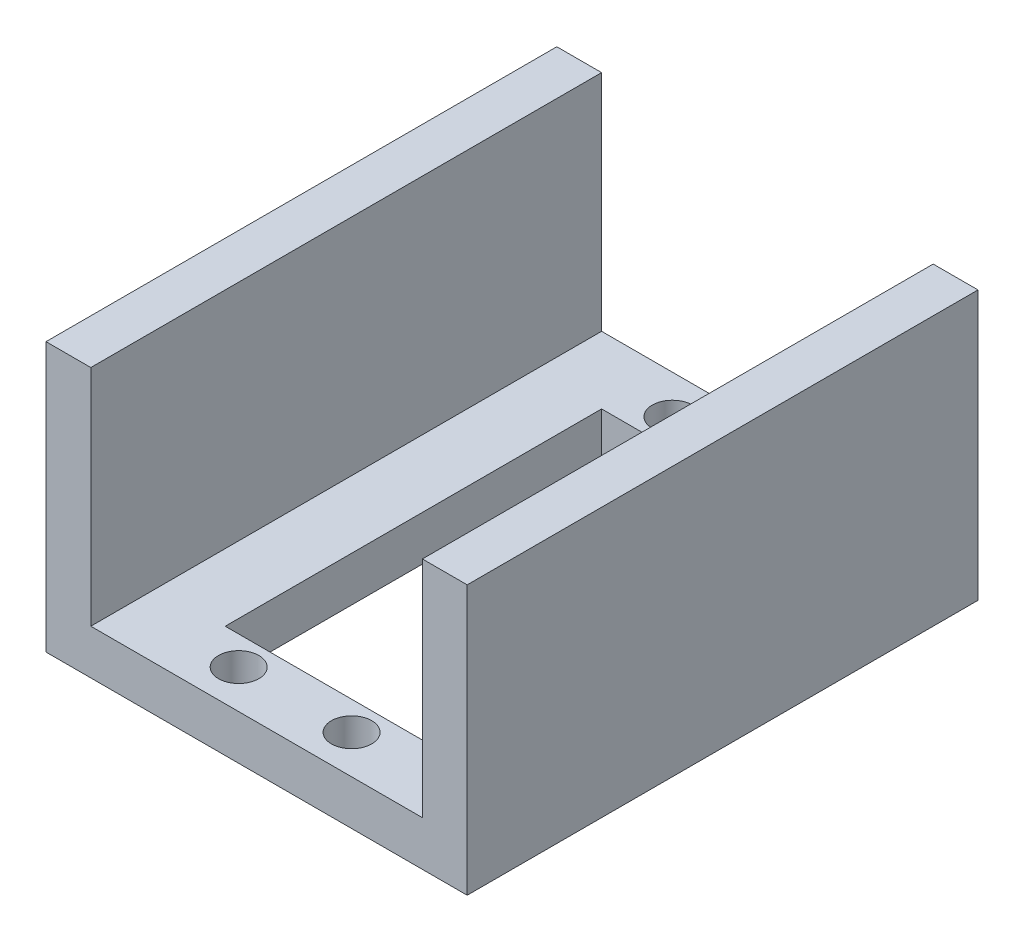
ISO-10303-21;
HEADER;
FILE_DESCRIPTION(('STEP AP214'),'2;1');
FILE_NAME('part.step','',(''),(''),'','','');
FILE_SCHEMA(('AUTOMOTIVE_DESIGN { 1 0 10303 214 1 1 1 1 }'));
ENDSEC;
DATA;
#1=APPLICATION_CONTEXT('core data for automotive mechanical design processes');
#2=APPLICATION_PROTOCOL_DEFINITION('international standard','automotive_design',2000,#1);
#3=PRODUCT_CONTEXT('',#1,'mechanical');
#4=PRODUCT('Part','Part','',(#3));
#5=PRODUCT_RELATED_PRODUCT_CATEGORY('part','',(#4));
#6=PRODUCT_DEFINITION_FORMATION('','',#4);
#7=PRODUCT_DEFINITION_CONTEXT('part definition',#1,'design');
#8=PRODUCT_DEFINITION('design','',#6,#7);
#9=PRODUCT_DEFINITION_SHAPE('','',#8);
#10=(LENGTH_UNIT() NAMED_UNIT(*) SI_UNIT(.MILLI.,.METRE.));
#11=(NAMED_UNIT(*) PLANE_ANGLE_UNIT() SI_UNIT($,.RADIAN.));
#12=(NAMED_UNIT(*) SI_UNIT($,.STERADIAN.) SOLID_ANGLE_UNIT());
#13=UNCERTAINTY_MEASURE_WITH_UNIT(LENGTH_MEASURE(1.E-05),#10,'distance_accuracy_value','');
#14=(GEOMETRIC_REPRESENTATION_CONTEXT(3) GLOBAL_UNCERTAINTY_ASSIGNED_CONTEXT((#13)) GLOBAL_UNIT_ASSIGNED_CONTEXT((#10,
#11,#12)) REPRESENTATION_CONTEXT('',''));
#15=CARTESIAN_POINT('',(0.,0.,0.));
#16=DIRECTION('',(0.,0.,1.));
#17=DIRECTION('',(1.,0.,0.));
#18=AXIS2_PLACEMENT_3D('',#15,#16,#17);
#19=CARTESIAN_POINT('',(0.,5.,0.));
#20=DIRECTION('',(0.,1.,0.));
#21=DIRECTION('',(0.,0.,1.00000000000001));
#22=AXIS2_PLACEMENT_3D('',#19,#20,#21);
#23=PLANE('',#22);
#24=CARTESIAN_POINT('',(-6.30000000000005,5.,-24.2000000000002));
#25=DIRECTION('',(0.,1.,0.));
#26=DIRECTION('',(0.,0.,1.00000000000001));
#27=AXIS2_PLACEMENT_3D('',#24,#25,#26);
#28=CIRCLE('',#27,2.24999999999999);
#29=CARTESIAN_POINT('',(-6.30000000000005,5.,-21.9500000000002));
#30=VERTEX_POINT('',#29);
#31=EDGE_CURVE('E210',#30,#30,#28,.T.);
#32=ORIENTED_EDGE('',*,*,#31,.F.);
#33=EDGE_LOOP('',(#32));
#34=FACE_BOUND('',#33,.T.);
#35=CARTESIAN_POINT('',(6.30000000000005,5.,-24.2000000000002));
#36=DIRECTION('',(0.,1.,0.));
#37=DIRECTION('',(0.,0.,1.00000000000001));
#38=AXIS2_PLACEMENT_3D('',#35,#36,#37);
#39=CIRCLE('',#38,2.24999999999999);
#40=CARTESIAN_POINT('',(6.30000000000005,5.,-21.9500000000002));
#41=VERTEX_POINT('',#40);
#42=EDGE_CURVE('E218',#41,#41,#39,.T.);
#43=ORIENTED_EDGE('',*,*,#42,.F.);
#44=EDGE_LOOP('',(#43));
#45=FACE_BOUND('',#44,.T.);
#46=CARTESIAN_POINT('',(-6.30000000000005,5.,24.2000000000002));
#47=DIRECTION('',(0.,1.,0.));
#48=DIRECTION('',(0.,0.,1.00000000000001));
#49=AXIS2_PLACEMENT_3D('',#46,#47,#48);
#50=CIRCLE('',#49,2.24999999999999);
#51=CARTESIAN_POINT('',(-6.30000000000005,5.,26.4500000000002));
#52=VERTEX_POINT('',#51);
#53=EDGE_CURVE('E226',#52,#52,#50,.T.);
#54=ORIENTED_EDGE('',*,*,#53,.F.);
#55=EDGE_LOOP('',(#54));
#56=FACE_BOUND('',#55,.T.);
#57=CARTESIAN_POINT('',(6.30000000000006,5.,24.2000000000002));
#58=DIRECTION('',(0.,1.,0.));
#59=DIRECTION('',(0.,0.,1.00000000000001));
#60=AXIS2_PLACEMENT_3D('',#57,#58,#59);
#61=CIRCLE('',#60,2.24999999999999);
#62=CARTESIAN_POINT('',(6.30000000000006,5.,26.4500000000002));
#63=VERTEX_POINT('',#62);
#64=EDGE_CURVE('E234',#63,#63,#61,.T.);
#65=ORIENTED_EDGE('',*,*,#64,.F.);
#66=EDGE_LOOP('',(#65));
#67=FACE_BOUND('',#66,.T.);
#68=DIRECTION('',(1.00000000000001,0.,0.));
#69=VECTOR('',#68,1.);
#70=CARTESIAN_POINT('',(-18.5000000000001,5.,28.5000000000002));
#71=LINE('',#70,#69);
#72=CARTESIAN_POINT('',(-18.5000000000001,5.,28.5000000000002));
#73=VERTEX_POINT('',#72);
#74=CARTESIAN_POINT('',(18.5000000000001,5.,28.5000000000002));
#75=VERTEX_POINT('',#74);
#76=EDGE_CURVE('E280',#73,#75,#71,.T.);
#77=ORIENTED_EDGE('',*,*,#76,.T.);
#78=DIRECTION('',(0.,0.,-1.00000000000001));
#79=VECTOR('',#78,1.);
#80=CARTESIAN_POINT('',(18.5000000000001,5.,28.5000000000002));
#81=LINE('',#80,#79);
#82=CARTESIAN_POINT('',(18.5000000000001,5.,-28.5000000000002));
#83=VERTEX_POINT('',#82);
#84=EDGE_CURVE('E170',#75,#83,#81,.T.);
#85=ORIENTED_EDGE('',*,*,#84,.T.);
#86=DIRECTION('',(-1.00000000000001,0.,0.));
#87=VECTOR('',#86,1.);
#88=CARTESIAN_POINT('',(-18.5000000000001,5.,-28.5000000000002));
#89=LINE('',#88,#87);
#90=CARTESIAN_POINT('',(-18.5000000000001,5.,-28.5000000000002));
#91=VERTEX_POINT('',#90);
#92=EDGE_CURVE('E61',#83,#91,#89,.T.);
#93=ORIENTED_EDGE('',*,*,#92,.T.);
#94=DIRECTION('',(0.,0.,1.00000000000001));
#95=VECTOR('',#94,1.);
#96=CARTESIAN_POINT('',(-18.5000000000001,5.,28.5000000000002));
#97=LINE('',#96,#95);
#98=EDGE_CURVE('E13',#91,#73,#97,.T.);
#99=ORIENTED_EDGE('',*,*,#98,.T.);
#100=EDGE_LOOP('',(#77,#85,#93,#99));
#101=FACE_BOUND('',#100,.T.);
#102=DIRECTION('',(-1.00000000000001,0.,0.));
#103=VECTOR('',#102,1.);
#104=CARTESIAN_POINT('',(-11.,5.,-21.0000000000001));
#105=LINE('',#104,#103);
#106=CARTESIAN_POINT('',(11.0000000000001,5.,-21.0000000000001));
#107=VERTEX_POINT('',#106);
#108=CARTESIAN_POINT('',(-11.,5.,-21.0000000000001));
#109=VERTEX_POINT('',#108);
#110=EDGE_CURVE('E245',#107,#109,#105,.T.);
#111=ORIENTED_EDGE('',*,*,#110,.F.);
#112=DIRECTION('',(0.,0.,-1.00000000000001));
#113=VECTOR('',#112,1.);
#114=CARTESIAN_POINT('',(11.0000000000001,5.,21.0000000000001));
#115=LINE('',#114,#113);
#116=CARTESIAN_POINT('',(11.0000000000001,5.,21.0000000000001));
#117=VERTEX_POINT('',#116);
#118=EDGE_CURVE('E242',#117,#107,#115,.T.);
#119=ORIENTED_EDGE('',*,*,#118,.F.);
#120=DIRECTION('',(1.00000000000001,0.,0.));
#121=VECTOR('',#120,1.);
#122=CARTESIAN_POINT('',(-11.,5.,21.0000000000001));
#123=LINE('',#122,#121);
#124=CARTESIAN_POINT('',(-11.,5.,21.0000000000001));
#125=VERTEX_POINT('',#124);
#126=EDGE_CURVE('E252',#125,#117,#123,.T.);
#127=ORIENTED_EDGE('',*,*,#126,.F.);
#128=DIRECTION('',(0.,0.,1.00000000000001));
#129=VECTOR('',#128,1.);
#130=CARTESIAN_POINT('',(-11.,5.,21.0000000000001));
#131=LINE('',#130,#129);
#132=EDGE_CURVE('E249',#109,#125,#131,.T.);
#133=ORIENTED_EDGE('',*,*,#132,.F.);
#134=EDGE_LOOP('',(#111,#119,#127,#133));
#135=FACE_BOUND('',#134,.T.);
#136=ADVANCED_FACE('F51',(#34,#45,#56,#67,#101,#135),#23,.T.);
#137=CARTESIAN_POINT('',(0.,0.,0.));
#138=DIRECTION('',(0.,1.,0.));
#139=DIRECTION('',(0.,0.,1.00000000000001));
#140=AXIS2_PLACEMENT_3D('',#137,#138,#139);
#141=PLANE('',#140);
#142=CARTESIAN_POINT('',(-6.30000000000005,0.,-24.2000000000002));
#143=DIRECTION('',(0.,1.,0.));
#144=DIRECTION('',(0.,0.,1.00000000000001));
#145=AXIS2_PLACEMENT_3D('',#142,#143,#144);
#146=CIRCLE('',#145,2.25);
#147=CARTESIAN_POINT('',(-6.30000000000005,0.,-21.9500000000002));
#148=VERTEX_POINT('',#147);
#149=EDGE_CURVE('E214',#148,#148,#146,.T.);
#150=ORIENTED_EDGE('',*,*,#149,.T.);
#151=EDGE_LOOP('',(#150));
#152=FACE_BOUND('',#151,.T.);
#153=CARTESIAN_POINT('',(6.30000000000005,0.,-24.2000000000002));
#154=DIRECTION('',(0.,1.,0.));
#155=DIRECTION('',(0.,0.,1.00000000000001));
#156=AXIS2_PLACEMENT_3D('',#153,#154,#155);
#157=CIRCLE('',#156,2.25);
#158=CARTESIAN_POINT('',(6.30000000000005,0.,-21.9500000000002));
#159=VERTEX_POINT('',#158);
#160=EDGE_CURVE('E222',#159,#159,#157,.T.);
#161=ORIENTED_EDGE('',*,*,#160,.T.);
#162=EDGE_LOOP('',(#161));
#163=FACE_BOUND('',#162,.T.);
#164=CARTESIAN_POINT('',(-6.30000000000005,0.,24.2000000000002));
#165=DIRECTION('',(0.,1.,0.));
#166=DIRECTION('',(0.,0.,1.00000000000001));
#167=AXIS2_PLACEMENT_3D('',#164,#165,#166);
#168=CIRCLE('',#167,2.25);
#169=CARTESIAN_POINT('',(-6.30000000000005,0.,26.4500000000002));
#170=VERTEX_POINT('',#169);
#171=EDGE_CURVE('E230',#170,#170,#168,.T.);
#172=ORIENTED_EDGE('',*,*,#171,.T.);
#173=EDGE_LOOP('',(#172));
#174=FACE_BOUND('',#173,.T.);
#175=CARTESIAN_POINT('',(6.30000000000006,0.,24.2000000000002));
#176=DIRECTION('',(0.,1.,0.));
#177=DIRECTION('',(0.,0.,1.00000000000001));
#178=AXIS2_PLACEMENT_3D('',#175,#176,#177);
#179=CIRCLE('',#178,2.25);
#180=CARTESIAN_POINT('',(6.30000000000006,0.,26.4500000000002));
#181=VERTEX_POINT('',#180);
#182=EDGE_CURVE('E238',#181,#181,#179,.T.);
#183=ORIENTED_EDGE('',*,*,#182,.T.);
#184=EDGE_LOOP('',(#183));
#185=FACE_BOUND('',#184,.T.);
#186=DIRECTION('',(1.00000000000001,0.,0.));
#187=VECTOR('',#186,1.);
#188=CARTESIAN_POINT('',(-18.5000000000001,0.,28.5000000000002));
#189=LINE('',#188,#187);
#190=CARTESIAN_POINT('',(-23.5000000000002,0.,28.5000000000002));
#191=VERTEX_POINT('',#190);
#192=CARTESIAN_POINT('',(23.5000000000002,0.,28.5000000000002));
#193=VERTEX_POINT('',#192);
#194=EDGE_CURVE('E279',#191,#193,#189,.T.);
#195=ORIENTED_EDGE('',*,*,#194,.F.);
#196=DIRECTION('',(0.,0.,1.00000000000001));
#197=VECTOR('',#196,1.);
#198=CARTESIAN_POINT('',(-23.5000000000002,0.,-28.5000000000002));
#199=LINE('',#198,#197);
#200=CARTESIAN_POINT('',(-23.5000000000002,0.,-28.5000000000002));
#201=VERTEX_POINT('',#200);
#202=EDGE_CURVE('E172',#201,#191,#199,.T.);
#203=ORIENTED_EDGE('',*,*,#202,.F.);
#204=DIRECTION('',(-1.00000000000001,0.,0.));
#205=VECTOR('',#204,1.);
#206=CARTESIAN_POINT('',(-18.5000000000001,0.,-28.5000000000002));
#207=LINE('',#206,#205);
#208=CARTESIAN_POINT('',(23.5000000000002,0.,-28.5000000000002));
#209=VERTEX_POINT('',#208);
#210=EDGE_CURVE('E55',#209,#201,#207,.T.);
#211=ORIENTED_EDGE('',*,*,#210,.F.);
#212=DIRECTION('',(0.,0.,-1.00000000000001));
#213=VECTOR('',#212,1.);
#214=CARTESIAN_POINT('',(23.5000000000002,0.,-28.5000000000002));
#215=LINE('',#214,#213);
#216=EDGE_CURVE('E166',#193,#209,#215,.T.);
#217=ORIENTED_EDGE('',*,*,#216,.F.);
#218=EDGE_LOOP('',(#195,#203,#211,#217));
#219=FACE_BOUND('',#218,.T.);
#220=DIRECTION('',(0.,0.,-1.00000000000001));
#221=VECTOR('',#220,1.);
#222=CARTESIAN_POINT('',(11.0000000000001,0.,21.0000000000001));
#223=LINE('',#222,#221);
#224=CARTESIAN_POINT('',(11.0000000000001,0.,21.0000000000001));
#225=VERTEX_POINT('',#224);
#226=CARTESIAN_POINT('',(11.0000000000001,0.,-21.0000000000001));
#227=VERTEX_POINT('',#226);
#228=EDGE_CURVE('E77',#225,#227,#223,.T.);
#229=ORIENTED_EDGE('',*,*,#228,.T.);
#230=DIRECTION('',(-1.00000000000001,0.,0.));
#231=VECTOR('',#230,1.);
#232=CARTESIAN_POINT('',(-11.,0.,-21.0000000000001));
#233=LINE('',#232,#231);
#234=CARTESIAN_POINT('',(-11.,0.,-21.0000000000001));
#235=VERTEX_POINT('',#234);
#236=EDGE_CURVE('E258',#227,#235,#233,.T.);
#237=ORIENTED_EDGE('',*,*,#236,.T.);
#238=DIRECTION('',(0.,0.,1.00000000000001));
#239=VECTOR('',#238,1.);
#240=CARTESIAN_POINT('',(-11.,0.,21.0000000000001));
#241=LINE('',#240,#239);
#242=CARTESIAN_POINT('',(-11.,0.,21.0000000000001));
#243=VERTEX_POINT('',#242);
#244=EDGE_CURVE('E262',#235,#243,#241,.T.);
#245=ORIENTED_EDGE('',*,*,#244,.T.);
#246=DIRECTION('',(1.00000000000001,0.,0.));
#247=VECTOR('',#246,1.);
#248=CARTESIAN_POINT('',(-11.,0.,21.0000000000001));
#249=LINE('',#248,#247);
#250=EDGE_CURVE('E246',#243,#225,#249,.T.);
#251=ORIENTED_EDGE('',*,*,#250,.T.);
#252=EDGE_LOOP('',(#229,#237,#245,#251));
#253=FACE_BOUND('',#252,.T.);
#254=ADVANCED_FACE('F302',(#152,#163,#174,#185,#219,#253),#141,.F.);
#255=CARTESIAN_POINT('',(-18.5000000000001,5.,28.5000000000002));
#256=DIRECTION('',(0.,0.,-1.00000000000001));
#257=DIRECTION('',(-1.00000000000001,0.,0.));
#258=AXIS2_PLACEMENT_3D('',#255,#256,#257);
#259=PLANE('',#258);
#260=ORIENTED_EDGE('',*,*,#194,.T.);
#261=DIRECTION('',(0.,-1.,0.));
#262=VECTOR('',#261,1.);
#263=CARTESIAN_POINT('',(23.5000000000002,30.,28.5000000000002));
#264=LINE('',#263,#262);
#265=CARTESIAN_POINT('',(23.5000000000002,30.,28.5000000000002));
#266=VERTEX_POINT('',#265);
#267=EDGE_CURVE('E152',#266,#193,#264,.T.);
#268=ORIENTED_EDGE('',*,*,#267,.F.);
#269=DIRECTION('',(1.00000000000001,0.,0.));
#270=VECTOR('',#269,1.);
#271=CARTESIAN_POINT('',(18.5000000000001,30.,28.5000000000002));
#272=LINE('',#271,#270);
#273=CARTESIAN_POINT('',(18.5000000000001,30.,28.5000000000002));
#274=VERTEX_POINT('',#273);
#275=EDGE_CURVE('E145',#274,#266,#272,.T.);
#276=ORIENTED_EDGE('',*,*,#275,.F.);
#277=DIRECTION('',(0.,-1.,0.));
#278=VECTOR('',#277,1.);
#279=CARTESIAN_POINT('',(18.5000000000001,30.,28.5000000000002));
#280=LINE('',#279,#278);
#281=EDGE_CURVE('E149',#274,#75,#280,.T.);
#282=ORIENTED_EDGE('',*,*,#281,.T.);
#283=ORIENTED_EDGE('',*,*,#76,.F.);
#284=DIRECTION('',(0.,-1.,0.));
#285=VECTOR('',#284,1.);
#286=CARTESIAN_POINT('',(-18.5000000000001,30.,28.5000000000002));
#287=LINE('',#286,#285);
#288=CARTESIAN_POINT('',(-18.5000000000001,30.,28.5000000000002));
#289=VERTEX_POINT('',#288);
#290=EDGE_CURVE('E194',#289,#73,#287,.T.);
#291=ORIENTED_EDGE('',*,*,#290,.F.);
#292=DIRECTION('',(1.00000000000001,0.,0.));
#293=VECTOR('',#292,1.);
#294=CARTESIAN_POINT('',(-18.5000000000001,30.,28.5000000000002));
#295=LINE('',#294,#293);
#296=CARTESIAN_POINT('',(-23.5000000000002,30.,28.5000000000002));
#297=VERTEX_POINT('',#296);
#298=EDGE_CURVE('E192',#297,#289,#295,.T.);
#299=ORIENTED_EDGE('',*,*,#298,.F.);
#300=DIRECTION('',(0.,-1.,0.));
#301=VECTOR('',#300,1.);
#302=CARTESIAN_POINT('',(-23.5000000000002,30.,28.5000000000002));
#303=LINE('',#302,#301);
#304=EDGE_CURVE('E198',#297,#191,#303,.T.);
#305=ORIENTED_EDGE('',*,*,#304,.T.);
#306=EDGE_LOOP('',(#260,#268,#276,#282,#283,#291,#299,#305));
#307=FACE_BOUND('',#306,.T.);
#308=ADVANCED_FACE('F53',(#307),#259,.F.);
#309=CARTESIAN_POINT('',(-18.5000000000001,5.,-28.5000000000002));
#310=DIRECTION('',(0.,0.,1.00000000000001));
#311=DIRECTION('',(1.00000000000001,0.,0.));
#312=AXIS2_PLACEMENT_3D('',#309,#310,#311);
#313=PLANE('',#312);
#314=ORIENTED_EDGE('',*,*,#210,.T.);
#315=DIRECTION('',(0.,-1.,0.));
#316=VECTOR('',#315,1.);
#317=CARTESIAN_POINT('',(-23.5000000000002,30.,-28.5000000000002));
#318=LINE('',#317,#316);
#319=CARTESIAN_POINT('',(-23.5000000000002,30.,-28.5000000000002));
#320=VERTEX_POINT('',#319);
#321=EDGE_CURVE('E202',#320,#201,#318,.T.);
#322=ORIENTED_EDGE('',*,*,#321,.F.);
#323=DIRECTION('',(-1.00000000000001,0.,0.));
#324=VECTOR('',#323,1.);
#325=CARTESIAN_POINT('',(-18.5000000000001,30.,-28.5000000000002));
#326=LINE('',#325,#324);
#327=CARTESIAN_POINT('',(-18.5000000000001,30.,-28.5000000000002));
#328=VERTEX_POINT('',#327);
#329=EDGE_CURVE('E186',#328,#320,#326,.T.);
#330=ORIENTED_EDGE('',*,*,#329,.F.);
#331=DIRECTION('',(0.,-1.,0.));
#332=VECTOR('',#331,1.);
#333=CARTESIAN_POINT('',(-18.5000000000001,30.,-28.5000000000002));
#334=LINE('',#333,#332);
#335=EDGE_CURVE('E206',#328,#91,#334,.T.);
#336=ORIENTED_EDGE('',*,*,#335,.T.);
#337=ORIENTED_EDGE('',*,*,#92,.F.);
#338=DIRECTION('',(0.,-1.,0.));
#339=VECTOR('',#338,1.);
#340=CARTESIAN_POINT('',(18.5000000000001,30.,-28.5000000000002));
#341=LINE('',#340,#339);
#342=CARTESIAN_POINT('',(18.5000000000001,30.,-28.5000000000002));
#343=VERTEX_POINT('',#342);
#344=EDGE_CURVE('E310',#343,#83,#341,.T.);
#345=ORIENTED_EDGE('',*,*,#344,.F.);
#346=DIRECTION('',(-1.00000000000001,0.,0.));
#347=VECTOR('',#346,1.);
#348=CARTESIAN_POINT('',(18.5000000000001,30.,-28.5000000000002));
#349=LINE('',#348,#347);
#350=CARTESIAN_POINT('',(23.5000000000002,30.,-28.5000000000002));
#351=VERTEX_POINT('',#350);
#352=EDGE_CURVE('E162',#351,#343,#349,.T.);
#353=ORIENTED_EDGE('',*,*,#352,.F.);
#354=DIRECTION('',(0.,-1.,0.));
#355=VECTOR('',#354,1.);
#356=CARTESIAN_POINT('',(23.5000000000002,30.,-28.5000000000002));
#357=LINE('',#356,#355);
#358=EDGE_CURVE('E179',#351,#209,#357,.T.);
#359=ORIENTED_EDGE('',*,*,#358,.T.);
#360=EDGE_LOOP('',(#314,#322,#330,#336,#337,#345,#353,#359));
#361=FACE_BOUND('',#360,.T.);
#362=ADVANCED_FACE('F292',(#361),#313,.F.);
#363=CARTESIAN_POINT('',(11.0000000000001,5.,21.0000000000001));
#364=DIRECTION('',(-1.00000000000001,0.,0.));
#365=DIRECTION('',(0.,0.,1.00000000000001));
#366=AXIS2_PLACEMENT_3D('',#363,#364,#365);
#367=PLANE('',#366);
#368=ORIENTED_EDGE('',*,*,#228,.F.);
#369=DIRECTION('',(0.,-1.,0.));
#370=VECTOR('',#369,1.);
#371=CARTESIAN_POINT('',(11.0000000000001,5.,21.0000000000001));
#372=LINE('',#371,#370);
#373=EDGE_CURVE('E255',#117,#225,#372,.T.);
#374=ORIENTED_EDGE('',*,*,#373,.F.);
#375=ORIENTED_EDGE('',*,*,#118,.T.);
#376=DIRECTION('',(0.,-1.,0.));
#377=VECTOR('',#376,1.);
#378=CARTESIAN_POINT('',(11.0000000000001,5.,-21.0000000000001));
#379=LINE('',#378,#377);
#380=EDGE_CURVE('E276',#107,#227,#379,.T.);
#381=ORIENTED_EDGE('',*,*,#380,.T.);
#382=EDGE_LOOP('',(#368,#374,#375,#381));
#383=FACE_BOUND('',#382,.T.);
#384=ADVANCED_FACE('F346',(#383),#367,.T.);
#385=CARTESIAN_POINT('',(-11.,5.,-21.0000000000001));
#386=DIRECTION('',(0.,0.,1.00000000000001));
#387=DIRECTION('',(1.00000000000001,0.,0.));
#388=AXIS2_PLACEMENT_3D('',#385,#386,#387);
#389=PLANE('',#388);
#390=ORIENTED_EDGE('',*,*,#236,.F.);
#391=ORIENTED_EDGE('',*,*,#380,.F.);
#392=ORIENTED_EDGE('',*,*,#110,.T.);
#393=DIRECTION('',(0.,-1.,0.));
#394=VECTOR('',#393,1.);
#395=CARTESIAN_POINT('',(-11.,5.,-21.0000000000001));
#396=LINE('',#395,#394);
#397=EDGE_CURVE('E273',#109,#235,#396,.T.);
#398=ORIENTED_EDGE('',*,*,#397,.T.);
#399=EDGE_LOOP('',(#390,#391,#392,#398));
#400=FACE_BOUND('',#399,.T.);
#401=ADVANCED_FACE('F353',(#400),#389,.T.);
#402=CARTESIAN_POINT('',(-11.,5.,21.0000000000001));
#403=DIRECTION('',(1.00000000000001,0.,0.));
#404=DIRECTION('',(0.,0.,-1.00000000000001));
#405=AXIS2_PLACEMENT_3D('',#402,#403,#404);
#406=PLANE('',#405);
#407=ORIENTED_EDGE('',*,*,#244,.F.);
#408=ORIENTED_EDGE('',*,*,#397,.F.);
#409=ORIENTED_EDGE('',*,*,#132,.T.);
#410=DIRECTION('',(0.,-1.,0.));
#411=VECTOR('',#410,1.);
#412=CARTESIAN_POINT('',(-11.,5.,21.0000000000001));
#413=LINE('',#412,#411);
#414=EDGE_CURVE('E69',#125,#243,#413,.T.);
#415=ORIENTED_EDGE('',*,*,#414,.T.);
#416=EDGE_LOOP('',(#407,#408,#409,#415));
#417=FACE_BOUND('',#416,.T.);
#418=ADVANCED_FACE('F390',(#417),#406,.T.);
#419=CARTESIAN_POINT('',(-11.,5.,21.0000000000001));
#420=DIRECTION('',(0.,0.,-1.00000000000001));
#421=DIRECTION('',(-1.00000000000001,0.,0.));
#422=AXIS2_PLACEMENT_3D('',#419,#420,#421);
#423=PLANE('',#422);
#424=ORIENTED_EDGE('',*,*,#250,.F.);
#425=ORIENTED_EDGE('',*,*,#414,.F.);
#426=ORIENTED_EDGE('',*,*,#126,.T.);
#427=ORIENTED_EDGE('',*,*,#373,.T.);
#428=EDGE_LOOP('',(#424,#425,#426,#427));
#429=FACE_BOUND('',#428,.T.);
#430=ADVANCED_FACE('F397',(#429),#423,.T.);
#431=CARTESIAN_POINT('',(6.30000000000006,5.,24.2000000000002));
#432=DIRECTION('',(0.,1.,0.));
#433=DIRECTION('',(0.,0.,1.00000000000001));
#434=AXIS2_PLACEMENT_3D('',#431,#432,#433);
#435=CYLINDRICAL_SURFACE('',#434,2.24999999999999);
#436=ORIENTED_EDGE('',*,*,#182,.F.);
#437=EDGE_LOOP('',(#436));
#438=FACE_BOUND('',#437,.T.);
#439=ORIENTED_EDGE('',*,*,#64,.T.);
#440=EDGE_LOOP('',(#439));
#441=FACE_BOUND('',#440,.T.);
#442=ADVANCED_FACE('F405',(#438,#441),#435,.F.);
#443=CARTESIAN_POINT('',(-6.30000000000005,5.,24.2000000000002));
#444=DIRECTION('',(0.,1.,0.));
#445=DIRECTION('',(0.,0.,1.00000000000001));
#446=AXIS2_PLACEMENT_3D('',#443,#444,#445);
#447=CYLINDRICAL_SURFACE('',#446,2.24999999999999);
#448=ORIENTED_EDGE('',*,*,#171,.F.);
#449=EDGE_LOOP('',(#448));
#450=FACE_BOUND('',#449,.T.);
#451=ORIENTED_EDGE('',*,*,#53,.T.);
#452=EDGE_LOOP('',(#451));
#453=FACE_BOUND('',#452,.T.);
#454=ADVANCED_FACE('F412',(#450,#453),#447,.F.);
#455=CARTESIAN_POINT('',(6.30000000000005,5.,-24.2000000000002));
#456=DIRECTION('',(0.,1.,0.));
#457=DIRECTION('',(0.,0.,1.00000000000001));
#458=AXIS2_PLACEMENT_3D('',#455,#456,#457);
#459=CYLINDRICAL_SURFACE('',#458,2.24999999999999);
#460=ORIENTED_EDGE('',*,*,#160,.F.);
#461=EDGE_LOOP('',(#460));
#462=FACE_BOUND('',#461,.T.);
#463=ORIENTED_EDGE('',*,*,#42,.T.);
#464=EDGE_LOOP('',(#463));
#465=FACE_BOUND('',#464,.T.);
#466=ADVANCED_FACE('F420',(#462,#465),#459,.F.);
#467=CARTESIAN_POINT('',(-6.30000000000005,5.,-24.2000000000002));
#468=DIRECTION('',(0.,1.,0.));
#469=DIRECTION('',(0.,0.,1.00000000000001));
#470=AXIS2_PLACEMENT_3D('',#467,#468,#469);
#471=CYLINDRICAL_SURFACE('',#470,2.24999999999999);
#472=ORIENTED_EDGE('',*,*,#149,.F.);
#473=EDGE_LOOP('',(#472));
#474=FACE_BOUND('',#473,.T.);
#475=ORIENTED_EDGE('',*,*,#31,.T.);
#476=EDGE_LOOP('',(#475));
#477=FACE_BOUND('',#476,.T.);
#478=ADVANCED_FACE('F427',(#474,#477),#471,.F.);
#479=CARTESIAN_POINT('',(-18.5000000000001,30.,-28.5000000000002));
#480=DIRECTION('',(-1.00000000000001,0.,0.));
#481=DIRECTION('',(0.,0.,1.00000000000001));
#482=AXIS2_PLACEMENT_3D('',#479,#480,#481);
#483=PLANE('',#482);
#484=ORIENTED_EDGE('',*,*,#98,.F.);
#485=ORIENTED_EDGE('',*,*,#335,.F.);
#486=DIRECTION('',(0.,0.,-1.00000000000001));
#487=VECTOR('',#486,1.);
#488=CARTESIAN_POINT('',(-18.5000000000001,30.,-28.5000000000002));
#489=LINE('',#488,#487);
#490=EDGE_CURVE('E177',#289,#328,#489,.T.);
#491=ORIENTED_EDGE('',*,*,#490,.F.);
#492=ORIENTED_EDGE('',*,*,#290,.T.);
#493=EDGE_LOOP('',(#484,#485,#491,#492));
#494=FACE_BOUND('',#493,.T.);
#495=ADVANCED_FACE('F324',(#494),#483,.F.);
#496=CARTESIAN_POINT('',(-23.5000000000002,30.,-28.5000000000002));
#497=DIRECTION('',(1.00000000000001,0.,0.));
#498=DIRECTION('',(0.,0.,-1.00000000000001));
#499=AXIS2_PLACEMENT_3D('',#496,#497,#498);
#500=PLANE('',#499);
#501=ORIENTED_EDGE('',*,*,#202,.T.);
#502=ORIENTED_EDGE('',*,*,#304,.F.);
#503=DIRECTION('',(0.,0.,1.00000000000001));
#504=VECTOR('',#503,1.);
#505=CARTESIAN_POINT('',(-23.5000000000002,30.,-28.5000000000002));
#506=LINE('',#505,#504);
#507=EDGE_CURVE('E189',#320,#297,#506,.T.);
#508=ORIENTED_EDGE('',*,*,#507,.F.);
#509=ORIENTED_EDGE('',*,*,#321,.T.);
#510=EDGE_LOOP('',(#501,#502,#508,#509));
#511=FACE_BOUND('',#510,.T.);
#512=ADVANCED_FACE('F300',(#511),#500,.F.);
#513=CARTESIAN_POINT('',(0.,30.,0.));
#514=DIRECTION('',(0.,-1.,0.));
#515=DIRECTION('',(0.,0.,-1.00000000000001));
#516=AXIS2_PLACEMENT_3D('',#513,#514,#515);
#517=PLANE('',#516);
#518=ORIENTED_EDGE('',*,*,#490,.T.);
#519=ORIENTED_EDGE('',*,*,#329,.T.);
#520=ORIENTED_EDGE('',*,*,#507,.T.);
#521=ORIENTED_EDGE('',*,*,#298,.T.);
#522=EDGE_LOOP('',(#518,#519,#520,#521));
#523=FACE_BOUND('',#522,.T.);
#524=ADVANCED_FACE('F326',(#523),#517,.F.);
#525=CARTESIAN_POINT('',(18.5000000000001,30.,-28.5000000000002));
#526=DIRECTION('',(1.00000000000001,0.,0.));
#527=DIRECTION('',(0.,0.,-1.00000000000001));
#528=AXIS2_PLACEMENT_3D('',#525,#526,#527);
#529=PLANE('',#528);
#530=ORIENTED_EDGE('',*,*,#84,.F.);
#531=ORIENTED_EDGE('',*,*,#281,.F.);
#532=DIRECTION('',(0.,0.,1.00000000000001));
#533=VECTOR('',#532,1.);
#534=CARTESIAN_POINT('',(18.5000000000001,30.,-28.5000000000002));
#535=LINE('',#534,#533);
#536=EDGE_CURVE('E157',#343,#274,#535,.T.);
#537=ORIENTED_EDGE('',*,*,#536,.F.);
#538=ORIENTED_EDGE('',*,*,#344,.T.);
#539=EDGE_LOOP('',(#530,#531,#537,#538));
#540=FACE_BOUND('',#539,.T.);
#541=ADVANCED_FACE('F168',(#540),#529,.F.);
#542=CARTESIAN_POINT('',(23.5000000000002,30.,-28.5000000000002));
#543=DIRECTION('',(-1.00000000000001,0.,0.));
#544=DIRECTION('',(0.,0.,1.00000000000001));
#545=AXIS2_PLACEMENT_3D('',#542,#543,#544);
#546=PLANE('',#545);
#547=ORIENTED_EDGE('',*,*,#216,.T.);
#548=ORIENTED_EDGE('',*,*,#358,.F.);
#549=DIRECTION('',(0.,0.,-1.00000000000001));
#550=VECTOR('',#549,1.);
#551=CARTESIAN_POINT('',(23.5000000000002,30.,-28.5000000000002));
#552=LINE('',#551,#550);
#553=EDGE_CURVE('E156',#266,#351,#552,.T.);
#554=ORIENTED_EDGE('',*,*,#553,.F.);
#555=ORIENTED_EDGE('',*,*,#267,.T.);
#556=EDGE_LOOP('',(#547,#548,#554,#555));
#557=FACE_BOUND('',#556,.T.);
#558=ADVANCED_FACE('F315',(#557),#546,.F.);
#559=CARTESIAN_POINT('',(0.,30.,0.));
#560=DIRECTION('',(0.,1.,0.));
#561=DIRECTION('',(0.,0.,1.00000000000001));
#562=AXIS2_PLACEMENT_3D('',#559,#560,#561);
#563=PLANE('',#562);
#564=ORIENTED_EDGE('',*,*,#536,.T.);
#565=ORIENTED_EDGE('',*,*,#275,.T.);
#566=ORIENTED_EDGE('',*,*,#553,.T.);
#567=ORIENTED_EDGE('',*,*,#352,.T.);
#568=EDGE_LOOP('',(#564,#565,#566,#567));
#569=FACE_BOUND('',#568,.T.);
#570=ADVANCED_FACE('F160',(#569),#563,.T.);
#571=CLOSED_SHELL('',(#136,#254,#308,#362,#384,#401,#418,#430,#442,#454,#466,#478,#495,#512,
#524,#541,#558,#570));
#572=MANIFOLD_SOLID_BREP('B2',#571);
#573=ADVANCED_BREP_SHAPE_REPRESENTATION('',(#18,#572),#14);
#574=SHAPE_DEFINITION_REPRESENTATION(#9,#573);
ENDSEC;
END-ISO-10303-21;
